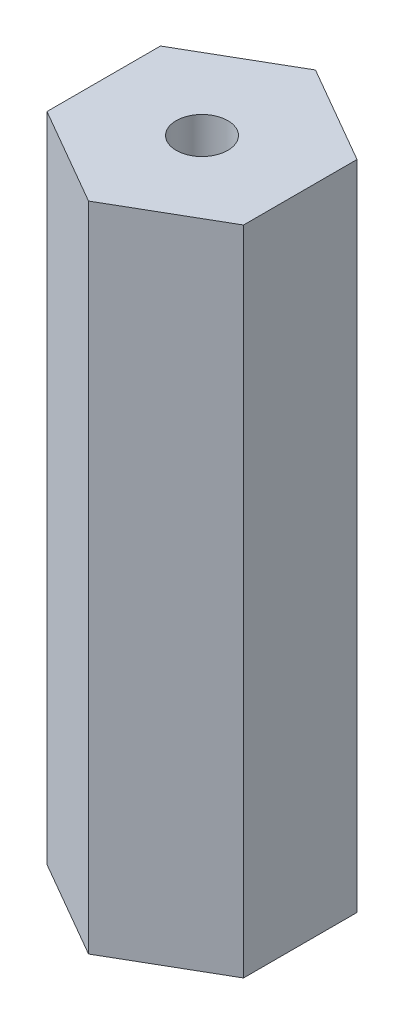
ISO-10303-21;
HEADER;
FILE_DESCRIPTION(('STEP AP214'),'2;1');
FILE_NAME('part.step','',(''),(''),'','','');
FILE_SCHEMA(('AUTOMOTIVE_DESIGN { 1 0 10303 214 1 1 1 1 }'));
ENDSEC;
DATA;
#1=APPLICATION_CONTEXT('core data for automotive mechanical design processes');
#2=APPLICATION_PROTOCOL_DEFINITION('international standard','automotive_design',2000,#1);
#3=PRODUCT_CONTEXT('',#1,'mechanical');
#4=PRODUCT('Part','Part','',(#3));
#5=PRODUCT_RELATED_PRODUCT_CATEGORY('part','',(#4));
#6=PRODUCT_DEFINITION_FORMATION('','',#4);
#7=PRODUCT_DEFINITION_CONTEXT('part definition',#1,'design');
#8=PRODUCT_DEFINITION('design','',#6,#7);
#9=PRODUCT_DEFINITION_SHAPE('','',#8);
#10=(LENGTH_UNIT() NAMED_UNIT(*) SI_UNIT(.MILLI.,.METRE.));
#11=(NAMED_UNIT(*) PLANE_ANGLE_UNIT() SI_UNIT($,.RADIAN.));
#12=(NAMED_UNIT(*) SI_UNIT($,.STERADIAN.) SOLID_ANGLE_UNIT());
#13=UNCERTAINTY_MEASURE_WITH_UNIT(LENGTH_MEASURE(1.E-05),#10,'distance_accuracy_value','');
#14=(GEOMETRIC_REPRESENTATION_CONTEXT(3) GLOBAL_UNCERTAINTY_ASSIGNED_CONTEXT((#13)) GLOBAL_UNIT_ASSIGNED_CONTEXT((#10,
#11,#12)) REPRESENTATION_CONTEXT('',''));
#15=CARTESIAN_POINT('',(0.,0.,0.));
#16=DIRECTION('',(0.,0.,1.));
#17=DIRECTION('',(1.,0.,0.));
#18=AXIS2_PLACEMENT_3D('',#15,#16,#17);
#19=CARTESIAN_POINT('',(2.2606,15.,1.30515801853007));
#20=DIRECTION('',(-1.,0.,0.));
#21=DIRECTION('',(0.,0.,1.));
#22=AXIS2_PLACEMENT_3D('',#19,#20,#21);
#23=PLANE('',#22);
#24=DIRECTION('',(0.,0.,-1.));
#25=VECTOR('',#24,1.);
#26=CARTESIAN_POINT('',(2.2606,0.,1.30515801853007));
#27=LINE('',#26,#25);
#28=CARTESIAN_POINT('',(2.2606,0.,1.30515801853007));
#29=VERTEX_POINT('',#28);
#30=CARTESIAN_POINT('',(2.2606,0.,-1.30515801853007));
#31=VERTEX_POINT('',#30);
#32=EDGE_CURVE('E120',#29,#31,#27,.T.);
#33=ORIENTED_EDGE('',*,*,#32,.T.);
#34=DIRECTION('',(0.,-1.,0.));
#35=VECTOR('',#34,1.);
#36=CARTESIAN_POINT('',(2.2606,15.,-1.30515801853007));
#37=LINE('',#36,#35);
#38=CARTESIAN_POINT('',(2.2606,15.,-1.30515801853007));
#39=VERTEX_POINT('',#38);
#40=EDGE_CURVE('E11',#39,#31,#37,.T.);
#41=ORIENTED_EDGE('',*,*,#40,.F.);
#42=DIRECTION('',(0.,0.,-1.));
#43=VECTOR('',#42,1.);
#44=CARTESIAN_POINT('',(2.2606,15.,1.30515801853007));
#45=LINE('',#44,#43);
#46=CARTESIAN_POINT('',(2.2606,15.,1.30515801853007));
#47=VERTEX_POINT('',#46);
#48=EDGE_CURVE('E131',#47,#39,#45,.T.);
#49=ORIENTED_EDGE('',*,*,#48,.F.);
#50=DIRECTION('',(0.,-1.,0.));
#51=VECTOR('',#50,1.);
#52=CARTESIAN_POINT('',(2.2606,15.,1.30515801853007));
#53=LINE('',#52,#51);
#54=EDGE_CURVE('E116',#47,#29,#53,.T.);
#55=ORIENTED_EDGE('',*,*,#54,.T.);
#56=EDGE_LOOP('',(#33,#41,#49,#55));
#57=FACE_BOUND('',#56,.T.);
#58=ADVANCED_FACE('F36',(#57),#23,.F.);
#59=CARTESIAN_POINT('',(2.2606,15.,-1.30515801853007));
#60=DIRECTION('',(-0.5,0.,0.866025403784439));
#61=DIRECTION('',(0.866025403784439,0.,0.5));
#62=AXIS2_PLACEMENT_3D('',#59,#60,#61);
#63=PLANE('',#62);
#64=DIRECTION('',(-0.866025403784439,0.,-0.5));
#65=VECTOR('',#64,1.);
#66=CARTESIAN_POINT('',(2.2606,0.,-1.30515801853007));
#67=LINE('',#66,#65);
#68=CARTESIAN_POINT('',(0.,0.,-2.61031603706014));
#69=VERTEX_POINT('',#68);
#70=EDGE_CURVE('E123',#31,#69,#67,.T.);
#71=ORIENTED_EDGE('',*,*,#70,.T.);
#72=DIRECTION('',(0.,-1.,0.));
#73=VECTOR('',#72,1.);
#74=CARTESIAN_POINT('',(0.,15.,-2.61031603706014));
#75=LINE('',#74,#73);
#76=CARTESIAN_POINT('',(0.,15.,-2.61031603706014));
#77=VERTEX_POINT('',#76);
#78=EDGE_CURVE('E44',#77,#69,#75,.T.);
#79=ORIENTED_EDGE('',*,*,#78,.F.);
#80=DIRECTION('',(-0.866025403784439,0.,-0.5));
#81=VECTOR('',#80,1.);
#82=CARTESIAN_POINT('',(2.2606,15.,-1.30515801853007));
#83=LINE('',#82,#81);
#84=EDGE_CURVE('E89',#39,#77,#83,.T.);
#85=ORIENTED_EDGE('',*,*,#84,.F.);
#86=ORIENTED_EDGE('',*,*,#40,.T.);
#87=EDGE_LOOP('',(#71,#79,#85,#86));
#88=FACE_BOUND('',#87,.T.);
#89=ADVANCED_FACE('F156',(#88),#63,.F.);
#90=CARTESIAN_POINT('',(0.,15.,-2.61031603706014));
#91=DIRECTION('',(0.5,0.,0.866025403784439));
#92=DIRECTION('',(0.866025403784439,0.,-0.5));
#93=AXIS2_PLACEMENT_3D('',#90,#91,#92);
#94=PLANE('',#93);
#95=DIRECTION('',(-0.866025403784439,0.,0.5));
#96=VECTOR('',#95,1.);
#97=CARTESIAN_POINT('',(0.,0.,-2.61031603706014));
#98=LINE('',#97,#96);
#99=CARTESIAN_POINT('',(-2.2606,0.,-1.30515801853007));
#100=VERTEX_POINT('',#99);
#101=EDGE_CURVE('E126',#69,#100,#98,.T.);
#102=ORIENTED_EDGE('',*,*,#101,.T.);
#103=DIRECTION('',(0.,-1.,0.));
#104=VECTOR('',#103,1.);
#105=CARTESIAN_POINT('',(-2.2606,15.,-1.30515801853007));
#106=LINE('',#105,#104);
#107=CARTESIAN_POINT('',(-2.2606,15.,-1.30515801853007));
#108=VERTEX_POINT('',#107);
#109=EDGE_CURVE('E111',#108,#100,#106,.T.);
#110=ORIENTED_EDGE('',*,*,#109,.F.);
#111=DIRECTION('',(-0.866025403784439,0.,0.5));
#112=VECTOR('',#111,1.);
#113=CARTESIAN_POINT('',(0.,15.,-2.61031603706014));
#114=LINE('',#113,#112);
#115=EDGE_CURVE('E102',#77,#108,#114,.T.);
#116=ORIENTED_EDGE('',*,*,#115,.F.);
#117=ORIENTED_EDGE('',*,*,#78,.T.);
#118=EDGE_LOOP('',(#102,#110,#116,#117));
#119=FACE_BOUND('',#118,.T.);
#120=ADVANCED_FACE('F137',(#119),#94,.F.);
#121=CARTESIAN_POINT('',(-2.2606,15.,-1.30515801853007));
#122=DIRECTION('',(1.,0.,0.));
#123=DIRECTION('',(0.,0.,-1.));
#124=AXIS2_PLACEMENT_3D('',#121,#122,#123);
#125=PLANE('',#124);
#126=DIRECTION('',(0.,0.,1.));
#127=VECTOR('',#126,1.);
#128=CARTESIAN_POINT('',(-2.2606,0.,-1.30515801853007));
#129=LINE('',#128,#127);
#130=CARTESIAN_POINT('',(-2.2606,0.,1.30515801853007));
#131=VERTEX_POINT('',#130);
#132=EDGE_CURVE('E110',#100,#131,#129,.T.);
#133=ORIENTED_EDGE('',*,*,#132,.T.);
#134=DIRECTION('',(0.,-1.,0.));
#135=VECTOR('',#134,1.);
#136=CARTESIAN_POINT('',(-2.2606,15.,1.30515801853007));
#137=LINE('',#136,#135);
#138=CARTESIAN_POINT('',(-2.2606,15.,1.30515801853007));
#139=VERTEX_POINT('',#138);
#140=EDGE_CURVE('E107',#139,#131,#137,.T.);
#141=ORIENTED_EDGE('',*,*,#140,.F.);
#142=DIRECTION('',(0.,0.,1.));
#143=VECTOR('',#142,1.);
#144=CARTESIAN_POINT('',(-2.2606,15.,-1.30515801853007));
#145=LINE('',#144,#143);
#146=EDGE_CURVE('E96',#108,#139,#145,.T.);
#147=ORIENTED_EDGE('',*,*,#146,.F.);
#148=ORIENTED_EDGE('',*,*,#109,.T.);
#149=EDGE_LOOP('',(#133,#141,#147,#148));
#150=FACE_BOUND('',#149,.T.);
#151=ADVANCED_FACE('F108',(#150),#125,.F.);
#152=CARTESIAN_POINT('',(-2.2606,15.,1.30515801853007));
#153=DIRECTION('',(0.5,0.,-0.866025403784439));
#154=DIRECTION('',(-0.866025403784439,0.,-0.5));
#155=AXIS2_PLACEMENT_3D('',#152,#153,#154);
#156=PLANE('',#155);
#157=DIRECTION('',(0.866025403784439,0.,0.5));
#158=VECTOR('',#157,1.);
#159=CARTESIAN_POINT('',(-2.2606,0.,1.30515801853007));
#160=LINE('',#159,#158);
#161=CARTESIAN_POINT('',(0.,0.,2.61031603706014));
#162=VERTEX_POINT('',#161);
#163=EDGE_CURVE('E75',#131,#162,#160,.T.);
#164=ORIENTED_EDGE('',*,*,#163,.T.);
#165=DIRECTION('',(0.,-1.,0.));
#166=VECTOR('',#165,1.);
#167=CARTESIAN_POINT('',(0.,15.,2.61031603706014));
#168=LINE('',#167,#166);
#169=CARTESIAN_POINT('',(0.,15.,2.61031603706014));
#170=VERTEX_POINT('',#169);
#171=EDGE_CURVE('E112',#170,#162,#168,.T.);
#172=ORIENTED_EDGE('',*,*,#171,.F.);
#173=DIRECTION('',(0.866025403784439,0.,0.5));
#174=VECTOR('',#173,1.);
#175=CARTESIAN_POINT('',(-2.2606,15.,1.30515801853007));
#176=LINE('',#175,#174);
#177=EDGE_CURVE('E100',#139,#170,#176,.T.);
#178=ORIENTED_EDGE('',*,*,#177,.F.);
#179=ORIENTED_EDGE('',*,*,#140,.T.);
#180=EDGE_LOOP('',(#164,#172,#178,#179));
#181=FACE_BOUND('',#180,.T.);
#182=ADVANCED_FACE('F114',(#181),#156,.F.);
#183=CARTESIAN_POINT('',(0.,15.,2.61031603706014));
#184=DIRECTION('',(-0.5,0.,-0.866025403784438));
#185=DIRECTION('',(-0.866025403784439,0.,0.5));
#186=AXIS2_PLACEMENT_3D('',#183,#184,#185);
#187=PLANE('',#186);
#188=DIRECTION('',(0.866025403784438,0.,-0.5));
#189=VECTOR('',#188,1.);
#190=CARTESIAN_POINT('',(0.,0.,2.61031603706014));
#191=LINE('',#190,#189);
#192=EDGE_CURVE('E81',#162,#29,#191,.T.);
#193=ORIENTED_EDGE('',*,*,#192,.T.);
#194=ORIENTED_EDGE('',*,*,#54,.F.);
#195=DIRECTION('',(0.866025403784438,0.,-0.5));
#196=VECTOR('',#195,1.);
#197=CARTESIAN_POINT('',(0.,15.,2.61031603706014));
#198=LINE('',#197,#196);
#199=EDGE_CURVE('E52',#170,#47,#198,.T.);
#200=ORIENTED_EDGE('',*,*,#199,.F.);
#201=ORIENTED_EDGE('',*,*,#171,.T.);
#202=EDGE_LOOP('',(#193,#194,#200,#201));
#203=FACE_BOUND('',#202,.T.);
#204=ADVANCED_FACE('F144',(#203),#187,.F.);
#205=CARTESIAN_POINT('',(2.2606,15.,-1.30515801853007));
#206=DIRECTION('',(0.,1.,0.));
#207=DIRECTION('',(0.,0.,1.));
#208=AXIS2_PLACEMENT_3D('',#205,#206,#207);
#209=PLANE('',#208);
#210=CARTESIAN_POINT('',(0.,15.,0.));
#211=DIRECTION('',(0.,1.,0.));
#212=DIRECTION('',(0.,0.,1.));
#213=AXIS2_PLACEMENT_3D('',#210,#211,#212);
#214=CIRCLE('',#213,0.593671867306966);
#215=CARTESIAN_POINT('',(0.,15.,0.593671867306966));
#216=VERTEX_POINT('',#215);
#217=EDGE_CURVE('E211',#216,#216,#214,.T.);
#218=ORIENTED_EDGE('',*,*,#217,.F.);
#219=EDGE_LOOP('',(#218));
#220=FACE_BOUND('',#219,.T.);
#221=ORIENTED_EDGE('',*,*,#48,.T.);
#222=ORIENTED_EDGE('',*,*,#84,.T.);
#223=ORIENTED_EDGE('',*,*,#115,.T.);
#224=ORIENTED_EDGE('',*,*,#146,.T.);
#225=ORIENTED_EDGE('',*,*,#177,.T.);
#226=ORIENTED_EDGE('',*,*,#199,.T.);
#227=EDGE_LOOP('',(#221,#222,#223,#224,#225,#226));
#228=FACE_BOUND('',#227,.T.);
#229=ADVANCED_FACE('F98',(#220,#228),#209,.T.);
#230=CARTESIAN_POINT('',(2.2606,0.,-1.30515801853007));
#231=DIRECTION('',(0.,1.,0.));
#232=DIRECTION('',(0.,0.,1.));
#233=AXIS2_PLACEMENT_3D('',#230,#231,#232);
#234=PLANE('',#233);
#235=CARTESIAN_POINT('',(0.,0.,0.));
#236=DIRECTION('',(0.,1.,0.));
#237=DIRECTION('',(0.,0.,1.));
#238=AXIS2_PLACEMENT_3D('',#235,#236,#237);
#239=CIRCLE('',#238,0.593671867306966);
#240=CARTESIAN_POINT('',(0.,0.,0.593671867306966));
#241=VERTEX_POINT('',#240);
#242=EDGE_CURVE('E124',#241,#241,#239,.T.);
#243=ORIENTED_EDGE('',*,*,#242,.T.);
#244=EDGE_LOOP('',(#243));
#245=FACE_BOUND('',#244,.T.);
#246=ORIENTED_EDGE('',*,*,#32,.F.);
#247=ORIENTED_EDGE('',*,*,#192,.F.);
#248=ORIENTED_EDGE('',*,*,#163,.F.);
#249=ORIENTED_EDGE('',*,*,#132,.F.);
#250=ORIENTED_EDGE('',*,*,#101,.F.);
#251=ORIENTED_EDGE('',*,*,#70,.F.);
#252=EDGE_LOOP('',(#246,#247,#248,#249,#250,#251));
#253=FACE_BOUND('',#252,.T.);
#254=ADVANCED_FACE('F140',(#245,#253),#234,.F.);
#255=CARTESIAN_POINT('',(0.,0.,0.));
#256=DIRECTION('',(0.,1.,0.));
#257=DIRECTION('',(0.,0.,1.));
#258=AXIS2_PLACEMENT_3D('',#255,#256,#257);
#259=CYLINDRICAL_SURFACE('',#258,0.593671867306966);
#260=ORIENTED_EDGE('',*,*,#242,.F.);
#261=EDGE_LOOP('',(#260));
#262=FACE_BOUND('',#261,.T.);
#263=ORIENTED_EDGE('',*,*,#217,.T.);
#264=EDGE_LOOP('',(#263));
#265=FACE_BOUND('',#264,.T.);
#266=ADVANCED_FACE('F193',(#262,#265),#259,.F.);
#267=CLOSED_SHELL('',(#58,#89,#120,#151,#182,#204,#229,#254,#266));
#268=MANIFOLD_SOLID_BREP('B2',#267);
#269=ADVANCED_BREP_SHAPE_REPRESENTATION('',(#18,#268),#14);
#270=SHAPE_DEFINITION_REPRESENTATION(#9,#269);
ENDSEC;
END-ISO-10303-21;
